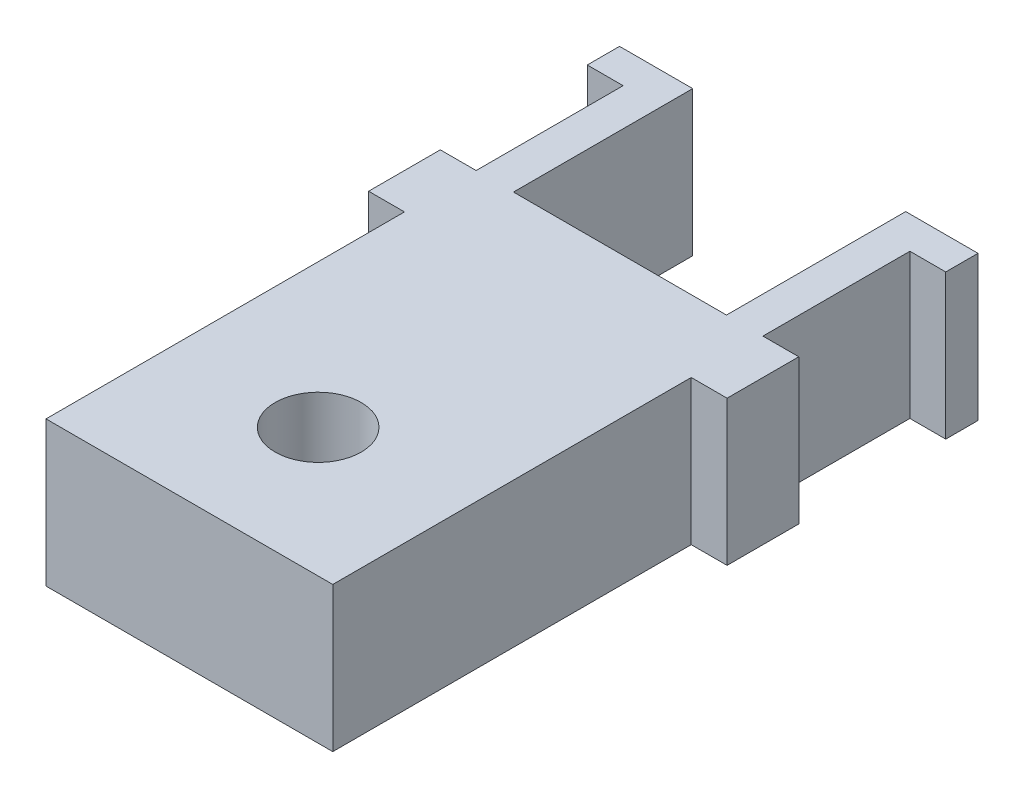
ISO-10303-21;
HEADER;
FILE_DESCRIPTION(('STEP AP214'),'2;1');
FILE_NAME('part.step','',(''),(''),'','','');
FILE_SCHEMA(('AUTOMOTIVE_DESIGN { 1 0 10303 214 1 1 1 1 }'));
ENDSEC;
DATA;
#1=APPLICATION_CONTEXT('core data for automotive mechanical design processes');
#2=APPLICATION_PROTOCOL_DEFINITION('international standard','automotive_design',2000,#1);
#3=PRODUCT_CONTEXT('',#1,'mechanical');
#4=PRODUCT('Part','Part','',(#3));
#5=PRODUCT_RELATED_PRODUCT_CATEGORY('part','',(#4));
#6=PRODUCT_DEFINITION_FORMATION('','',#4);
#7=PRODUCT_DEFINITION_CONTEXT('part definition',#1,'design');
#8=PRODUCT_DEFINITION('design','',#6,#7);
#9=PRODUCT_DEFINITION_SHAPE('','',#8);
#10=(LENGTH_UNIT() NAMED_UNIT(*) SI_UNIT(.MILLI.,.METRE.));
#11=(NAMED_UNIT(*) PLANE_ANGLE_UNIT() SI_UNIT($,.RADIAN.));
#12=(NAMED_UNIT(*) SI_UNIT($,.STERADIAN.) SOLID_ANGLE_UNIT());
#13=UNCERTAINTY_MEASURE_WITH_UNIT(LENGTH_MEASURE(1.E-05),#10,'distance_accuracy_value','');
#14=(GEOMETRIC_REPRESENTATION_CONTEXT(3) GLOBAL_UNCERTAINTY_ASSIGNED_CONTEXT((#13)) GLOBAL_UNIT_ASSIGNED_CONTEXT((#10,
#11,#12)) REPRESENTATION_CONTEXT('',''));
#15=CARTESIAN_POINT('',(0.,0.,0.));
#16=DIRECTION('',(0.,0.,1.));
#17=DIRECTION('',(1.,0.,0.));
#18=AXIS2_PLACEMENT_3D('',#15,#16,#17);
#19=CARTESIAN_POINT('',(0.,5.1308,0.));
#20=DIRECTION('',(0.,1.,0.));
#21=DIRECTION('',(0.,0.,1.));
#22=AXIS2_PLACEMENT_3D('',#19,#20,#21);
#23=PLANE('',#22);
#24=DIRECTION('',(0.,0.,-1.));
#25=VECTOR('',#24,1.);
#26=CARTESIAN_POINT('',(5.08,5.1308,-5.07999999999998));
#27=LINE('',#26,#25);
#28=CARTESIAN_POINT('',(5.08000000000001,5.1308,7.62000000000002));
#29=VERTEX_POINT('',#28);
#30=CARTESIAN_POINT('',(5.08,5.1308,-5.07999999999998));
#31=VERTEX_POINT('',#30);
#32=EDGE_CURVE('E241',#29,#31,#27,.T.);
#33=ORIENTED_EDGE('',*,*,#32,.T.);
#34=DIRECTION('',(1.,0.,0.));
#35=VECTOR('',#34,1.);
#36=CARTESIAN_POINT('',(6.35,5.1308,-5.07999999999998));
#37=LINE('',#36,#35);
#38=CARTESIAN_POINT('',(6.35,5.1308,-5.07999999999998));
#39=VERTEX_POINT('',#38);
#40=EDGE_CURVE('E129',#31,#39,#37,.T.);
#41=ORIENTED_EDGE('',*,*,#40,.T.);
#42=DIRECTION('',(0.,0.,-1.));
#43=VECTOR('',#42,1.);
#44=CARTESIAN_POINT('',(6.35,5.1308,-7.61999999999998));
#45=LINE('',#44,#43);
#46=CARTESIAN_POINT('',(6.35,5.1308,-7.61999999999998));
#47=VERTEX_POINT('',#46);
#48=EDGE_CURVE('E292',#39,#47,#45,.T.);
#49=ORIENTED_EDGE('',*,*,#48,.T.);
#50=DIRECTION('',(-1.,0.,0.));
#51=VECTOR('',#50,1.);
#52=CARTESIAN_POINT('',(6.35,5.1308,-7.61999999999998));
#53=LINE('',#52,#51);
#54=CARTESIAN_POINT('',(5.08,5.1308,-7.61999999999998));
#55=VERTEX_POINT('',#54);
#56=EDGE_CURVE('E311',#47,#55,#53,.T.);
#57=ORIENTED_EDGE('',*,*,#56,.T.);
#58=DIRECTION('',(0.,0.,-1.));
#59=VECTOR('',#58,1.);
#60=CARTESIAN_POINT('',(5.08,5.1308,-7.61999999999998));
#61=LINE('',#60,#59);
#62=CARTESIAN_POINT('',(5.08,5.1308,-12.827));
#63=VERTEX_POINT('',#62);
#64=EDGE_CURVE('E308',#55,#63,#61,.T.);
#65=ORIENTED_EDGE('',*,*,#64,.T.);
#66=DIRECTION('',(1.,0.,0.));
#67=VECTOR('',#66,1.);
#68=CARTESIAN_POINT('',(5.08,5.1308,-12.827));
#69=LINE('',#68,#67);
#70=CARTESIAN_POINT('',(6.35,5.1308,-12.827));
#71=VERTEX_POINT('',#70);
#72=EDGE_CURVE('E310',#63,#71,#69,.T.);
#73=ORIENTED_EDGE('',*,*,#72,.T.);
#74=DIRECTION('',(0.,0.,-1.));
#75=VECTOR('',#74,1.);
#76=CARTESIAN_POINT('',(6.35,5.1308,-12.827));
#77=LINE('',#76,#75);
#78=CARTESIAN_POINT('',(6.35,5.1308,-13.97));
#79=VERTEX_POINT('',#78);
#80=EDGE_CURVE('E313',#71,#79,#77,.T.);
#81=ORIENTED_EDGE('',*,*,#80,.T.);
#82=DIRECTION('',(-1.,0.,0.));
#83=VECTOR('',#82,1.);
#84=CARTESIAN_POINT('',(6.35,5.1308,-13.97));
#85=LINE('',#84,#83);
#86=CARTESIAN_POINT('',(3.78911020790426,5.1308,-13.97));
#87=VERTEX_POINT('',#86);
#88=EDGE_CURVE('E319',#79,#87,#85,.T.);
#89=ORIENTED_EDGE('',*,*,#88,.T.);
#90=DIRECTION('',(0.,0.,1.));
#91=VECTOR('',#90,1.);
#92=CARTESIAN_POINT('',(3.78911020790426,5.1308,-7.61999999999998));
#93=LINE('',#92,#91);
#94=CARTESIAN_POINT('',(3.78911020790426,5.1308,-7.61999999999998));
#95=VERTEX_POINT('',#94);
#96=EDGE_CURVE('E321',#87,#95,#93,.T.);
#97=ORIENTED_EDGE('',*,*,#96,.T.);
#98=DIRECTION('',(-1.,0.,0.));
#99=VECTOR('',#98,1.);
#100=CARTESIAN_POINT('',(-3.75783160857777,5.1308,-7.61999999999998));
#101=LINE('',#100,#99);
#102=CARTESIAN_POINT('',(-3.75783160857777,5.1308,-7.61999999999998));
#103=VERTEX_POINT('',#102);
#104=EDGE_CURVE('E323',#95,#103,#101,.T.);
#105=ORIENTED_EDGE('',*,*,#104,.T.);
#106=DIRECTION('',(0.,0.,-1.));
#107=VECTOR('',#106,1.);
#108=CARTESIAN_POINT('',(-3.75783160857777,5.1308,-7.61999999999998));
#109=LINE('',#108,#107);
#110=CARTESIAN_POINT('',(-3.75783160857777,5.1308,-13.97));
#111=VERTEX_POINT('',#110);
#112=EDGE_CURVE('E325',#103,#111,#109,.T.);
#113=ORIENTED_EDGE('',*,*,#112,.T.);
#114=DIRECTION('',(-1.,0.,0.));
#115=VECTOR('',#114,1.);
#116=CARTESIAN_POINT('',(-3.75783160857777,5.1308,-13.97));
#117=LINE('',#116,#115);
#118=CARTESIAN_POINT('',(-6.35,5.1308,-13.97));
#119=VERTEX_POINT('',#118);
#120=EDGE_CURVE('E327',#111,#119,#117,.T.);
#121=ORIENTED_EDGE('',*,*,#120,.T.);
#122=DIRECTION('',(0.,0.,1.));
#123=VECTOR('',#122,1.);
#124=CARTESIAN_POINT('',(-6.35,5.1308,-12.827));
#125=LINE('',#124,#123);
#126=CARTESIAN_POINT('',(-6.35,5.1308,-12.827));
#127=VERTEX_POINT('',#126);
#128=EDGE_CURVE('E329',#119,#127,#125,.T.);
#129=ORIENTED_EDGE('',*,*,#128,.T.);
#130=DIRECTION('',(1.,0.,0.));
#131=VECTOR('',#130,1.);
#132=CARTESIAN_POINT('',(-5.08,5.1308,-12.827));
#133=LINE('',#132,#131);
#134=CARTESIAN_POINT('',(-5.08,5.1308,-12.827));
#135=VERTEX_POINT('',#134);
#136=EDGE_CURVE('E331',#127,#135,#133,.T.);
#137=ORIENTED_EDGE('',*,*,#136,.T.);
#138=DIRECTION('',(0.,0.,1.));
#139=VECTOR('',#138,1.);
#140=CARTESIAN_POINT('',(-5.08,5.1308,-7.61999999999998));
#141=LINE('',#140,#139);
#142=CARTESIAN_POINT('',(-5.08,5.1308,-7.61999999999998));
#143=VERTEX_POINT('',#142);
#144=EDGE_CURVE('E333',#135,#143,#141,.T.);
#145=ORIENTED_EDGE('',*,*,#144,.T.);
#146=DIRECTION('',(-1.,0.,0.));
#147=VECTOR('',#146,1.);
#148=CARTESIAN_POINT('',(-6.35,5.1308,-7.61999999999998));
#149=LINE('',#148,#147);
#150=CARTESIAN_POINT('',(-6.35,5.1308,-7.61999999999998));
#151=VERTEX_POINT('',#150);
#152=EDGE_CURVE('E335',#143,#151,#149,.T.);
#153=ORIENTED_EDGE('',*,*,#152,.T.);
#154=DIRECTION('',(0.,0.,1.));
#155=VECTOR('',#154,1.);
#156=CARTESIAN_POINT('',(-6.35,5.1308,-7.61999999999998));
#157=LINE('',#156,#155);
#158=CARTESIAN_POINT('',(-6.35,5.1308,-5.07999999999998));
#159=VERTEX_POINT('',#158);
#160=EDGE_CURVE('E184',#151,#159,#157,.T.);
#161=ORIENTED_EDGE('',*,*,#160,.T.);
#162=DIRECTION('',(1.,0.,0.));
#163=VECTOR('',#162,1.);
#164=CARTESIAN_POINT('',(-6.35,5.1308,-5.07999999999998));
#165=LINE('',#164,#163);
#166=CARTESIAN_POINT('',(-5.08,5.1308,-5.07999999999998));
#167=VERTEX_POINT('',#166);
#168=EDGE_CURVE('E178',#159,#167,#165,.T.);
#169=ORIENTED_EDGE('',*,*,#168,.T.);
#170=DIRECTION('',(0.,0.,1.));
#171=VECTOR('',#170,1.);
#172=CARTESIAN_POINT('',(-5.08,5.1308,-5.07999999999998));
#173=LINE('',#172,#171);
#174=CARTESIAN_POINT('',(-5.08000000000004,5.1308,7.62000000000002));
#175=VERTEX_POINT('',#174);
#176=EDGE_CURVE('E182',#167,#175,#173,.T.);
#177=ORIENTED_EDGE('',*,*,#176,.T.);
#178=DIRECTION('',(1.,0.,0.));
#179=VECTOR('',#178,1.);
#180=CARTESIAN_POINT('',(-5.08000000000004,5.1308,7.62000000000002));
#181=LINE('',#180,#179);
#182=EDGE_CURVE('E50',#175,#29,#181,.T.);
#183=ORIENTED_EDGE('',*,*,#182,.T.);
#184=EDGE_LOOP('',(#33,#41,#49,#57,#65,#73,#81,#89,#97,#105,#113,#121,#129,#137,#145,#153,#161,
#169,#177,#183));
#185=FACE_BOUND('',#184,.T.);
#186=CARTESIAN_POINT('',(0.,5.1308,3.05755815516299));
#187=DIRECTION('',(0.,1.,0.));
#188=DIRECTION('',(0.,0.,1.));
#189=AXIS2_PLACEMENT_3D('',#186,#187,#188);
#190=CIRCLE('',#189,1.524);
#191=CARTESIAN_POINT('',(0.,5.1308,4.58155815516299));
#192=VERTEX_POINT('',#191);
#193=EDGE_CURVE('E206',#192,#192,#190,.T.);
#194=ORIENTED_EDGE('',*,*,#193,.F.);
#195=EDGE_LOOP('',(#194));
#196=FACE_BOUND('',#195,.T.);
#197=ADVANCED_FACE('F33',(#185,#196),#23,.T.);
#198=CARTESIAN_POINT('',(0.,0.,0.));
#199=DIRECTION('',(0.,1.,0.));
#200=DIRECTION('',(0.,0.,1.));
#201=AXIS2_PLACEMENT_3D('',#198,#199,#200);
#202=PLANE('',#201);
#203=DIRECTION('',(0.,0.,-1.));
#204=VECTOR('',#203,1.);
#205=CARTESIAN_POINT('',(5.08,0.,-5.07999999999998));
#206=LINE('',#205,#204);
#207=CARTESIAN_POINT('',(5.08000000000001,0.,7.62000000000002));
#208=VERTEX_POINT('',#207);
#209=CARTESIAN_POINT('',(5.08,0.,-5.07999999999998));
#210=VERTEX_POINT('',#209);
#211=EDGE_CURVE('E202',#208,#210,#206,.T.);
#212=ORIENTED_EDGE('',*,*,#211,.F.);
#213=DIRECTION('',(1.,0.,0.));
#214=VECTOR('',#213,1.);
#215=CARTESIAN_POINT('',(-5.08000000000004,0.,7.62000000000002));
#216=LINE('',#215,#214);
#217=CARTESIAN_POINT('',(-5.08000000000004,0.,7.62000000000002));
#218=VERTEX_POINT('',#217);
#219=EDGE_CURVE('E121',#218,#208,#216,.T.);
#220=ORIENTED_EDGE('',*,*,#219,.F.);
#221=DIRECTION('',(0.,0.,1.));
#222=VECTOR('',#221,1.);
#223=CARTESIAN_POINT('',(-5.08,0.,-5.07999999999998));
#224=LINE('',#223,#222);
#225=CARTESIAN_POINT('',(-5.08,0.,-5.07999999999998));
#226=VERTEX_POINT('',#225);
#227=EDGE_CURVE('E115',#226,#218,#224,.T.);
#228=ORIENTED_EDGE('',*,*,#227,.F.);
#229=DIRECTION('',(1.,0.,0.));
#230=VECTOR('',#229,1.);
#231=CARTESIAN_POINT('',(-6.35,0.,-5.07999999999998));
#232=LINE('',#231,#230);
#233=CARTESIAN_POINT('',(-6.35,0.,-5.07999999999998));
#234=VERTEX_POINT('',#233);
#235=EDGE_CURVE('E192',#234,#226,#232,.T.);
#236=ORIENTED_EDGE('',*,*,#235,.F.);
#237=DIRECTION('',(0.,0.,1.));
#238=VECTOR('',#237,1.);
#239=CARTESIAN_POINT('',(-6.35,0.,-7.61999999999998));
#240=LINE('',#239,#238);
#241=CARTESIAN_POINT('',(-6.35,0.,-7.61999999999998));
#242=VERTEX_POINT('',#241);
#243=EDGE_CURVE('E236',#242,#234,#240,.T.);
#244=ORIENTED_EDGE('',*,*,#243,.F.);
#245=DIRECTION('',(-1.,0.,0.));
#246=VECTOR('',#245,1.);
#247=CARTESIAN_POINT('',(-6.35,0.,-7.61999999999998));
#248=LINE('',#247,#246);
#249=CARTESIAN_POINT('',(-5.08,0.,-7.61999999999998));
#250=VERTEX_POINT('',#249);
#251=EDGE_CURVE('E234',#250,#242,#248,.T.);
#252=ORIENTED_EDGE('',*,*,#251,.F.);
#253=DIRECTION('',(0.,0.,1.));
#254=VECTOR('',#253,1.);
#255=CARTESIAN_POINT('',(-5.08,0.,-7.61999999999998));
#256=LINE('',#255,#254);
#257=CARTESIAN_POINT('',(-5.08,0.,-12.827));
#258=VERTEX_POINT('',#257);
#259=EDGE_CURVE('E232',#258,#250,#256,.T.);
#260=ORIENTED_EDGE('',*,*,#259,.F.);
#261=DIRECTION('',(1.,0.,0.));
#262=VECTOR('',#261,1.);
#263=CARTESIAN_POINT('',(-5.08,0.,-12.827));
#264=LINE('',#263,#262);
#265=CARTESIAN_POINT('',(-6.35,0.,-12.827));
#266=VERTEX_POINT('',#265);
#267=EDGE_CURVE('E230',#266,#258,#264,.T.);
#268=ORIENTED_EDGE('',*,*,#267,.F.);
#269=DIRECTION('',(0.,0.,1.));
#270=VECTOR('',#269,1.);
#271=CARTESIAN_POINT('',(-6.35,0.,-12.827));
#272=LINE('',#271,#270);
#273=CARTESIAN_POINT('',(-6.35,0.,-13.97));
#274=VERTEX_POINT('',#273);
#275=EDGE_CURVE('E228',#274,#266,#272,.T.);
#276=ORIENTED_EDGE('',*,*,#275,.F.);
#277=DIRECTION('',(-1.,0.,0.));
#278=VECTOR('',#277,1.);
#279=CARTESIAN_POINT('',(-3.75783160857777,0.,-13.97));
#280=LINE('',#279,#278);
#281=CARTESIAN_POINT('',(-3.75783160857777,0.,-13.97));
#282=VERTEX_POINT('',#281);
#283=EDGE_CURVE('E226',#282,#274,#280,.T.);
#284=ORIENTED_EDGE('',*,*,#283,.F.);
#285=DIRECTION('',(0.,0.,-1.));
#286=VECTOR('',#285,1.);
#287=CARTESIAN_POINT('',(-3.75783160857777,0.,-7.61999999999998));
#288=LINE('',#287,#286);
#289=CARTESIAN_POINT('',(-3.75783160857777,0.,-7.61999999999998));
#290=VERTEX_POINT('',#289);
#291=EDGE_CURVE('E224',#290,#282,#288,.T.);
#292=ORIENTED_EDGE('',*,*,#291,.F.);
#293=DIRECTION('',(-1.,0.,0.));
#294=VECTOR('',#293,1.);
#295=CARTESIAN_POINT('',(-3.75783160857777,0.,-7.61999999999998));
#296=LINE('',#295,#294);
#297=CARTESIAN_POINT('',(3.78911020790426,0.,-7.61999999999998));
#298=VERTEX_POINT('',#297);
#299=EDGE_CURVE('E222',#298,#290,#296,.T.);
#300=ORIENTED_EDGE('',*,*,#299,.F.);
#301=DIRECTION('',(0.,0.,1.));
#302=VECTOR('',#301,1.);
#303=CARTESIAN_POINT('',(3.78911020790426,0.,-7.61999999999998));
#304=LINE('',#303,#302);
#305=CARTESIAN_POINT('',(3.78911020790426,0.,-13.97));
#306=VERTEX_POINT('',#305);
#307=EDGE_CURVE('E220',#306,#298,#304,.T.);
#308=ORIENTED_EDGE('',*,*,#307,.F.);
#309=DIRECTION('',(-1.,0.,0.));
#310=VECTOR('',#309,1.);
#311=CARTESIAN_POINT('',(6.35,0.,-13.97));
#312=LINE('',#311,#310);
#313=CARTESIAN_POINT('',(6.35,0.,-13.97));
#314=VERTEX_POINT('',#313);
#315=EDGE_CURVE('E218',#314,#306,#312,.T.);
#316=ORIENTED_EDGE('',*,*,#315,.F.);
#317=DIRECTION('',(0.,0.,-1.));
#318=VECTOR('',#317,1.);
#319=CARTESIAN_POINT('',(6.35,0.,-12.827));
#320=LINE('',#319,#318);
#321=CARTESIAN_POINT('',(6.35,0.,-12.827));
#322=VERTEX_POINT('',#321);
#323=EDGE_CURVE('E216',#322,#314,#320,.T.);
#324=ORIENTED_EDGE('',*,*,#323,.F.);
#325=DIRECTION('',(1.,0.,0.));
#326=VECTOR('',#325,1.);
#327=CARTESIAN_POINT('',(5.08,0.,-12.827));
#328=LINE('',#327,#326);
#329=CARTESIAN_POINT('',(5.08,0.,-12.827));
#330=VERTEX_POINT('',#329);
#331=EDGE_CURVE('E214',#330,#322,#328,.T.);
#332=ORIENTED_EDGE('',*,*,#331,.F.);
#333=DIRECTION('',(0.,0.,-1.));
#334=VECTOR('',#333,1.);
#335=CARTESIAN_POINT('',(5.08,0.,-7.61999999999998));
#336=LINE('',#335,#334);
#337=CARTESIAN_POINT('',(5.08,0.,-7.61999999999998));
#338=VERTEX_POINT('',#337);
#339=EDGE_CURVE('E212',#338,#330,#336,.T.);
#340=ORIENTED_EDGE('',*,*,#339,.F.);
#341=DIRECTION('',(-1.,0.,0.));
#342=VECTOR('',#341,1.);
#343=CARTESIAN_POINT('',(6.35,0.,-7.61999999999998));
#344=LINE('',#343,#342);
#345=CARTESIAN_POINT('',(6.35,0.,-7.61999999999998));
#346=VERTEX_POINT('',#345);
#347=EDGE_CURVE('E210',#346,#338,#344,.T.);
#348=ORIENTED_EDGE('',*,*,#347,.F.);
#349=DIRECTION('',(0.,0.,-1.));
#350=VECTOR('',#349,1.);
#351=CARTESIAN_POINT('',(6.35,0.,-7.61999999999998));
#352=LINE('',#351,#350);
#353=CARTESIAN_POINT('',(6.35,0.,-5.07999999999998));
#354=VERTEX_POINT('',#353);
#355=EDGE_CURVE('E208',#354,#346,#352,.T.);
#356=ORIENTED_EDGE('',*,*,#355,.F.);
#357=DIRECTION('',(1.,0.,0.));
#358=VECTOR('',#357,1.);
#359=CARTESIAN_POINT('',(6.35,0.,-5.07999999999998));
#360=LINE('',#359,#358);
#361=EDGE_CURVE('E205',#210,#354,#360,.T.);
#362=ORIENTED_EDGE('',*,*,#361,.F.);
#363=EDGE_LOOP('',(#212,#220,#228,#236,#244,#252,#260,#268,#276,#284,#292,#300,#308,#316,#324,
#332,#340,#348,#356,#362));
#364=FACE_BOUND('',#363,.T.);
#365=CARTESIAN_POINT('',(0.,0.,3.05755815516299));
#366=DIRECTION('',(0.,1.,0.));
#367=DIRECTION('',(0.,0.,1.));
#368=AXIS2_PLACEMENT_3D('',#365,#366,#367);
#369=CIRCLE('',#368,1.524);
#370=CARTESIAN_POINT('',(0.,0.,4.58155815516299));
#371=VERTEX_POINT('',#370);
#372=EDGE_CURVE('E586',#371,#371,#369,.T.);
#373=ORIENTED_EDGE('',*,*,#372,.T.);
#374=EDGE_LOOP('',(#373));
#375=FACE_BOUND('',#374,.T.);
#376=ADVANCED_FACE('F296',(#364,#375),#202,.F.);
#377=CARTESIAN_POINT('',(5.08,5.1308,-5.07999999999998));
#378=DIRECTION('',(-1.,0.,0.));
#379=DIRECTION('',(0.,0.,1.));
#380=AXIS2_PLACEMENT_3D('',#377,#378,#379);
#381=PLANE('',#380);
#382=ORIENTED_EDGE('',*,*,#211,.T.);
#383=DIRECTION('',(0.,-1.,0.));
#384=VECTOR('',#383,1.);
#385=CARTESIAN_POINT('',(5.08,5.1308,-5.07999999999998));
#386=LINE('',#385,#384);
#387=EDGE_CURVE('E11',#31,#210,#386,.T.);
#388=ORIENTED_EDGE('',*,*,#387,.F.);
#389=ORIENTED_EDGE('',*,*,#32,.F.);
#390=DIRECTION('',(0.,-1.,0.));
#391=VECTOR('',#390,1.);
#392=CARTESIAN_POINT('',(5.08000000000001,5.1308,7.62000000000002));
#393=LINE('',#392,#391);
#394=EDGE_CURVE('E198',#29,#208,#393,.T.);
#395=ORIENTED_EDGE('',*,*,#394,.T.);
#396=EDGE_LOOP('',(#382,#388,#389,#395));
#397=FACE_BOUND('',#396,.T.);
#398=ADVANCED_FACE('F35',(#397),#381,.F.);
#399=CARTESIAN_POINT('',(6.35,5.1308,-5.07999999999998));
#400=DIRECTION('',(0.,0.,-1.));
#401=DIRECTION('',(-1.,0.,0.));
#402=AXIS2_PLACEMENT_3D('',#399,#400,#401);
#403=PLANE('',#402);
#404=ORIENTED_EDGE('',*,*,#361,.T.);
#405=DIRECTION('',(0.,-1.,0.));
#406=VECTOR('',#405,1.);
#407=CARTESIAN_POINT('',(6.35,5.1308,-5.07999999999998));
#408=LINE('',#407,#406);
#409=EDGE_CURVE('E42',#39,#354,#408,.T.);
#410=ORIENTED_EDGE('',*,*,#409,.F.);
#411=ORIENTED_EDGE('',*,*,#40,.F.);
#412=ORIENTED_EDGE('',*,*,#387,.T.);
#413=EDGE_LOOP('',(#404,#410,#411,#412));
#414=FACE_BOUND('',#413,.T.);
#415=ADVANCED_FACE('F369',(#414),#403,.F.);
#416=CARTESIAN_POINT('',(6.35,5.1308,-7.61999999999998));
#417=DIRECTION('',(-1.,0.,0.));
#418=DIRECTION('',(0.,0.,1.));
#419=AXIS2_PLACEMENT_3D('',#416,#417,#418);
#420=PLANE('',#419);
#421=ORIENTED_EDGE('',*,*,#355,.T.);
#422=DIRECTION('',(0.,-1.,0.));
#423=VECTOR('',#422,1.);
#424=CARTESIAN_POINT('',(6.35,5.1308,-7.61999999999998));
#425=LINE('',#424,#423);
#426=EDGE_CURVE('E284',#47,#346,#425,.T.);
#427=ORIENTED_EDGE('',*,*,#426,.F.);
#428=ORIENTED_EDGE('',*,*,#48,.F.);
#429=ORIENTED_EDGE('',*,*,#409,.T.);
#430=EDGE_LOOP('',(#421,#427,#428,#429));
#431=FACE_BOUND('',#430,.T.);
#432=ADVANCED_FACE('F290',(#431),#420,.F.);
#433=CARTESIAN_POINT('',(6.35,5.1308,-7.61999999999998));
#434=DIRECTION('',(0.,0.,1.));
#435=DIRECTION('',(1.,0.,0.));
#436=AXIS2_PLACEMENT_3D('',#433,#434,#435);
#437=PLANE('',#436);
#438=ORIENTED_EDGE('',*,*,#347,.T.);
#439=DIRECTION('',(0.,-1.,0.));
#440=VECTOR('',#439,1.);
#441=CARTESIAN_POINT('',(5.08,5.1308,-7.61999999999998));
#442=LINE('',#441,#440);
#443=EDGE_CURVE('E281',#55,#338,#442,.T.);
#444=ORIENTED_EDGE('',*,*,#443,.F.);
#445=ORIENTED_EDGE('',*,*,#56,.F.);
#446=ORIENTED_EDGE('',*,*,#426,.T.);
#447=EDGE_LOOP('',(#438,#444,#445,#446));
#448=FACE_BOUND('',#447,.T.);
#449=ADVANCED_FACE('F302',(#448),#437,.F.);
#450=CARTESIAN_POINT('',(5.08,5.1308,-7.61999999999998));
#451=DIRECTION('',(-1.,0.,0.));
#452=DIRECTION('',(0.,0.,1.));
#453=AXIS2_PLACEMENT_3D('',#450,#451,#452);
#454=PLANE('',#453);
#455=ORIENTED_EDGE('',*,*,#339,.T.);
#456=DIRECTION('',(0.,-1.,0.));
#457=VECTOR('',#456,1.);
#458=CARTESIAN_POINT('',(5.08,5.1308,-12.827));
#459=LINE('',#458,#457);
#460=EDGE_CURVE('E278',#63,#330,#459,.T.);
#461=ORIENTED_EDGE('',*,*,#460,.F.);
#462=ORIENTED_EDGE('',*,*,#64,.F.);
#463=ORIENTED_EDGE('',*,*,#443,.T.);
#464=EDGE_LOOP('',(#455,#461,#462,#463));
#465=FACE_BOUND('',#464,.T.);
#466=ADVANCED_FACE('F306',(#465),#454,.F.);
#467=CARTESIAN_POINT('',(5.08,5.1308,-12.827));
#468=DIRECTION('',(0.,0.,-1.));
#469=DIRECTION('',(-1.,0.,0.));
#470=AXIS2_PLACEMENT_3D('',#467,#468,#469);
#471=PLANE('',#470);
#472=ORIENTED_EDGE('',*,*,#331,.T.);
#473=DIRECTION('',(0.,-1.,0.));
#474=VECTOR('',#473,1.);
#475=CARTESIAN_POINT('',(6.35,5.1308,-12.827));
#476=LINE('',#475,#474);
#477=EDGE_CURVE('E275',#71,#322,#476,.T.);
#478=ORIENTED_EDGE('',*,*,#477,.F.);
#479=ORIENTED_EDGE('',*,*,#72,.F.);
#480=ORIENTED_EDGE('',*,*,#460,.T.);
#481=EDGE_LOOP('',(#472,#478,#479,#480));
#482=FACE_BOUND('',#481,.T.);
#483=ADVANCED_FACE('F382',(#482),#471,.F.);
#484=CARTESIAN_POINT('',(6.35,5.1308,-12.827));
#485=DIRECTION('',(-1.,0.,0.));
#486=DIRECTION('',(0.,0.,1.));
#487=AXIS2_PLACEMENT_3D('',#484,#485,#486);
#488=PLANE('',#487);
#489=ORIENTED_EDGE('',*,*,#323,.T.);
#490=DIRECTION('',(0.,-1.,0.));
#491=VECTOR('',#490,1.);
#492=CARTESIAN_POINT('',(6.35,5.1308,-13.97));
#493=LINE('',#492,#491);
#494=EDGE_CURVE('E272',#79,#314,#493,.T.);
#495=ORIENTED_EDGE('',*,*,#494,.F.);
#496=ORIENTED_EDGE('',*,*,#80,.F.);
#497=ORIENTED_EDGE('',*,*,#477,.T.);
#498=EDGE_LOOP('',(#489,#495,#496,#497));
#499=FACE_BOUND('',#498,.T.);
#500=ADVANCED_FACE('F385',(#499),#488,.F.);
#501=CARTESIAN_POINT('',(6.35,5.1308,-13.97));
#502=DIRECTION('',(0.,0.,1.));
#503=DIRECTION('',(1.,0.,0.));
#504=AXIS2_PLACEMENT_3D('',#501,#502,#503);
#505=PLANE('',#504);
#506=ORIENTED_EDGE('',*,*,#315,.T.);
#507=DIRECTION('',(0.,-1.,0.));
#508=VECTOR('',#507,1.);
#509=CARTESIAN_POINT('',(3.78911020790426,5.1308,-13.97));
#510=LINE('',#509,#508);
#511=EDGE_CURVE('E269',#87,#306,#510,.T.);
#512=ORIENTED_EDGE('',*,*,#511,.F.);
#513=ORIENTED_EDGE('',*,*,#88,.F.);
#514=ORIENTED_EDGE('',*,*,#494,.T.);
#515=EDGE_LOOP('',(#506,#512,#513,#514));
#516=FACE_BOUND('',#515,.T.);
#517=ADVANCED_FACE('F389',(#516),#505,.F.);
#518=CARTESIAN_POINT('',(3.78911020790426,5.1308,-7.61999999999998));
#519=DIRECTION('',(1.,0.,0.));
#520=DIRECTION('',(0.,0.,-1.));
#521=AXIS2_PLACEMENT_3D('',#518,#519,#520);
#522=PLANE('',#521);
#523=ORIENTED_EDGE('',*,*,#307,.T.);
#524=DIRECTION('',(0.,-1.,0.));
#525=VECTOR('',#524,1.);
#526=CARTESIAN_POINT('',(3.78911020790426,5.1308,-7.61999999999998));
#527=LINE('',#526,#525);
#528=EDGE_CURVE('E266',#95,#298,#527,.T.);
#529=ORIENTED_EDGE('',*,*,#528,.F.);
#530=ORIENTED_EDGE('',*,*,#96,.F.);
#531=ORIENTED_EDGE('',*,*,#511,.T.);
#532=EDGE_LOOP('',(#523,#529,#530,#531));
#533=FACE_BOUND('',#532,.T.);
#534=ADVANCED_FACE('F393',(#533),#522,.F.);
#535=CARTESIAN_POINT('',(-3.75783160857777,5.1308,-7.61999999999998));
#536=DIRECTION('',(0.,0.,1.));
#537=DIRECTION('',(1.,0.,0.));
#538=AXIS2_PLACEMENT_3D('',#535,#536,#537);
#539=PLANE('',#538);
#540=ORIENTED_EDGE('',*,*,#299,.T.);
#541=DIRECTION('',(0.,-1.,0.));
#542=VECTOR('',#541,1.);
#543=CARTESIAN_POINT('',(-3.75783160857777,5.1308,-7.61999999999998));
#544=LINE('',#543,#542);
#545=EDGE_CURVE('E263',#103,#290,#544,.T.);
#546=ORIENTED_EDGE('',*,*,#545,.F.);
#547=ORIENTED_EDGE('',*,*,#104,.F.);
#548=ORIENTED_EDGE('',*,*,#528,.T.);
#549=EDGE_LOOP('',(#540,#546,#547,#548));
#550=FACE_BOUND('',#549,.T.);
#551=ADVANCED_FACE('F397',(#550),#539,.F.);
#552=CARTESIAN_POINT('',(-3.75783160857777,5.1308,-7.61999999999998));
#553=DIRECTION('',(-1.,0.,0.));
#554=DIRECTION('',(0.,0.,1.));
#555=AXIS2_PLACEMENT_3D('',#552,#553,#554);
#556=PLANE('',#555);
#557=ORIENTED_EDGE('',*,*,#291,.T.);
#558=DIRECTION('',(0.,-1.,0.));
#559=VECTOR('',#558,1.);
#560=CARTESIAN_POINT('',(-3.75783160857777,5.1308,-13.97));
#561=LINE('',#560,#559);
#562=EDGE_CURVE('E260',#111,#282,#561,.T.);
#563=ORIENTED_EDGE('',*,*,#562,.F.);
#564=ORIENTED_EDGE('',*,*,#112,.F.);
#565=ORIENTED_EDGE('',*,*,#545,.T.);
#566=EDGE_LOOP('',(#557,#563,#564,#565));
#567=FACE_BOUND('',#566,.T.);
#568=ADVANCED_FACE('F401',(#567),#556,.F.);
#569=CARTESIAN_POINT('',(-3.75783160857777,5.1308,-13.97));
#570=DIRECTION('',(0.,0.,1.));
#571=DIRECTION('',(1.,0.,0.));
#572=AXIS2_PLACEMENT_3D('',#569,#570,#571);
#573=PLANE('',#572);
#574=ORIENTED_EDGE('',*,*,#283,.T.);
#575=DIRECTION('',(0.,-1.,0.));
#576=VECTOR('',#575,1.);
#577=CARTESIAN_POINT('',(-6.35,5.1308,-13.97));
#578=LINE('',#577,#576);
#579=EDGE_CURVE('E257',#119,#274,#578,.T.);
#580=ORIENTED_EDGE('',*,*,#579,.F.);
#581=ORIENTED_EDGE('',*,*,#120,.F.);
#582=ORIENTED_EDGE('',*,*,#562,.T.);
#583=EDGE_LOOP('',(#574,#580,#581,#582));
#584=FACE_BOUND('',#583,.T.);
#585=ADVANCED_FACE('F405',(#584),#573,.F.);
#586=CARTESIAN_POINT('',(-6.35,5.1308,-12.827));
#587=DIRECTION('',(1.,0.,0.));
#588=DIRECTION('',(0.,0.,-1.));
#589=AXIS2_PLACEMENT_3D('',#586,#587,#588);
#590=PLANE('',#589);
#591=ORIENTED_EDGE('',*,*,#275,.T.);
#592=DIRECTION('',(0.,-1.,0.));
#593=VECTOR('',#592,1.);
#594=CARTESIAN_POINT('',(-6.35,5.1308,-12.827));
#595=LINE('',#594,#593);
#596=EDGE_CURVE('E254',#127,#266,#595,.T.);
#597=ORIENTED_EDGE('',*,*,#596,.F.);
#598=ORIENTED_EDGE('',*,*,#128,.F.);
#599=ORIENTED_EDGE('',*,*,#579,.T.);
#600=EDGE_LOOP('',(#591,#597,#598,#599));
#601=FACE_BOUND('',#600,.T.);
#602=ADVANCED_FACE('F409',(#601),#590,.F.);
#603=CARTESIAN_POINT('',(-5.08,5.1308,-12.827));
#604=DIRECTION('',(0.,0.,-1.));
#605=DIRECTION('',(-1.,0.,0.));
#606=AXIS2_PLACEMENT_3D('',#603,#604,#605);
#607=PLANE('',#606);
#608=ORIENTED_EDGE('',*,*,#267,.T.);
#609=DIRECTION('',(0.,-1.,0.));
#610=VECTOR('',#609,1.);
#611=CARTESIAN_POINT('',(-5.08,5.1308,-12.827));
#612=LINE('',#611,#610);
#613=EDGE_CURVE('E251',#135,#258,#612,.T.);
#614=ORIENTED_EDGE('',*,*,#613,.F.);
#615=ORIENTED_EDGE('',*,*,#136,.F.);
#616=ORIENTED_EDGE('',*,*,#596,.T.);
#617=EDGE_LOOP('',(#608,#614,#615,#616));
#618=FACE_BOUND('',#617,.T.);
#619=ADVANCED_FACE('F413',(#618),#607,.F.);
#620=CARTESIAN_POINT('',(-5.08,5.1308,-7.61999999999998));
#621=DIRECTION('',(1.,0.,0.));
#622=DIRECTION('',(0.,0.,-1.));
#623=AXIS2_PLACEMENT_3D('',#620,#621,#622);
#624=PLANE('',#623);
#625=ORIENTED_EDGE('',*,*,#259,.T.);
#626=DIRECTION('',(0.,-1.,0.));
#627=VECTOR('',#626,1.);
#628=CARTESIAN_POINT('',(-5.08,5.1308,-7.61999999999998));
#629=LINE('',#628,#627);
#630=EDGE_CURVE('E248',#143,#250,#629,.T.);
#631=ORIENTED_EDGE('',*,*,#630,.F.);
#632=ORIENTED_EDGE('',*,*,#144,.F.);
#633=ORIENTED_EDGE('',*,*,#613,.T.);
#634=EDGE_LOOP('',(#625,#631,#632,#633));
#635=FACE_BOUND('',#634,.T.);
#636=ADVANCED_FACE('F417',(#635),#624,.F.);
#637=CARTESIAN_POINT('',(-6.35,5.1308,-7.61999999999998));
#638=DIRECTION('',(0.,0.,1.));
#639=DIRECTION('',(1.,0.,0.));
#640=AXIS2_PLACEMENT_3D('',#637,#638,#639);
#641=PLANE('',#640);
#642=ORIENTED_EDGE('',*,*,#251,.T.);
#643=DIRECTION('',(0.,-1.,0.));
#644=VECTOR('',#643,1.);
#645=CARTESIAN_POINT('',(-6.35,5.1308,-7.61999999999998));
#646=LINE('',#645,#644);
#647=EDGE_CURVE('E245',#151,#242,#646,.T.);
#648=ORIENTED_EDGE('',*,*,#647,.F.);
#649=ORIENTED_EDGE('',*,*,#152,.F.);
#650=ORIENTED_EDGE('',*,*,#630,.T.);
#651=EDGE_LOOP('',(#642,#648,#649,#650));
#652=FACE_BOUND('',#651,.T.);
#653=ADVANCED_FACE('F341',(#652),#641,.F.);
#654=CARTESIAN_POINT('',(-6.35,5.1308,-7.61999999999998));
#655=DIRECTION('',(1.,0.,0.));
#656=DIRECTION('',(0.,0.,-1.));
#657=AXIS2_PLACEMENT_3D('',#654,#655,#656);
#658=PLANE('',#657);
#659=ORIENTED_EDGE('',*,*,#243,.T.);
#660=DIRECTION('',(0.,-1.,0.));
#661=VECTOR('',#660,1.);
#662=CARTESIAN_POINT('',(-6.35,5.1308,-5.07999999999998));
#663=LINE('',#662,#661);
#664=EDGE_CURVE('E193',#159,#234,#663,.T.);
#665=ORIENTED_EDGE('',*,*,#664,.F.);
#666=ORIENTED_EDGE('',*,*,#160,.F.);
#667=ORIENTED_EDGE('',*,*,#647,.T.);
#668=EDGE_LOOP('',(#659,#665,#666,#667));
#669=FACE_BOUND('',#668,.T.);
#670=ADVANCED_FACE('F345',(#669),#658,.F.);
#671=CARTESIAN_POINT('',(-6.35,5.1308,-5.07999999999998));
#672=DIRECTION('',(0.,0.,-1.));
#673=DIRECTION('',(-1.,0.,0.));
#674=AXIS2_PLACEMENT_3D('',#671,#672,#673);
#675=PLANE('',#674);
#676=ORIENTED_EDGE('',*,*,#235,.T.);
#677=DIRECTION('',(0.,-1.,0.));
#678=VECTOR('',#677,1.);
#679=CARTESIAN_POINT('',(-5.08,5.1308,-5.07999999999998));
#680=LINE('',#679,#678);
#681=EDGE_CURVE('E189',#167,#226,#680,.T.);
#682=ORIENTED_EDGE('',*,*,#681,.F.);
#683=ORIENTED_EDGE('',*,*,#168,.F.);
#684=ORIENTED_EDGE('',*,*,#664,.T.);
#685=EDGE_LOOP('',(#676,#682,#683,#684));
#686=FACE_BOUND('',#685,.T.);
#687=ADVANCED_FACE('F190',(#686),#675,.F.);
#688=CARTESIAN_POINT('',(-5.08,5.1308,-5.07999999999998));
#689=DIRECTION('',(1.,0.,0.));
#690=DIRECTION('',(0.,0.,-1.));
#691=AXIS2_PLACEMENT_3D('',#688,#689,#690);
#692=PLANE('',#691);
#693=ORIENTED_EDGE('',*,*,#227,.T.);
#694=DIRECTION('',(0.,-1.,0.));
#695=VECTOR('',#694,1.);
#696=CARTESIAN_POINT('',(-5.08000000000004,5.1308,7.62000000000002));
#697=LINE('',#696,#695);
#698=EDGE_CURVE('E194',#175,#218,#697,.T.);
#699=ORIENTED_EDGE('',*,*,#698,.F.);
#700=ORIENTED_EDGE('',*,*,#176,.F.);
#701=ORIENTED_EDGE('',*,*,#681,.T.);
#702=EDGE_LOOP('',(#693,#699,#700,#701));
#703=FACE_BOUND('',#702,.T.);
#704=ADVANCED_FACE('F196',(#703),#692,.F.);
#705=CARTESIAN_POINT('',(-5.08000000000004,5.1308,7.62000000000002));
#706=DIRECTION('',(0.,0.,-1.));
#707=DIRECTION('',(-1.,0.,0.));
#708=AXIS2_PLACEMENT_3D('',#705,#706,#707);
#709=PLANE('',#708);
#710=ORIENTED_EDGE('',*,*,#219,.T.);
#711=ORIENTED_EDGE('',*,*,#394,.F.);
#712=ORIENTED_EDGE('',*,*,#182,.F.);
#713=ORIENTED_EDGE('',*,*,#698,.T.);
#714=EDGE_LOOP('',(#710,#711,#712,#713));
#715=FACE_BOUND('',#714,.T.);
#716=ADVANCED_FACE('F349',(#715),#709,.F.);
#717=CARTESIAN_POINT('',(0.,5.1308,3.05755815516299));
#718=DIRECTION('',(0.,-1.,0.));
#719=DIRECTION('',(0.,0.,-1.));
#720=AXIS2_PLACEMENT_3D('',#717,#718,#719);
#721=CYLINDRICAL_SURFACE('',#720,1.524);
#722=ORIENTED_EDGE('',*,*,#193,.T.);
#723=EDGE_LOOP('',(#722));
#724=FACE_BOUND('',#723,.T.);
#725=ORIENTED_EDGE('',*,*,#372,.F.);
#726=EDGE_LOOP('',(#725));
#727=FACE_BOUND('',#726,.T.);
#728=ADVANCED_FACE('F351',(#724,#727),#721,.F.);
#729=CLOSED_SHELL('',(#197,#376,#398,#415,#432,#449,#466,#483,#500,#517,#534,#551,#568,#585,
#602,#619,#636,#653,#670,#687,#704,#716,#728));
#730=MANIFOLD_SOLID_BREP('B2',#729);
#731=ADVANCED_BREP_SHAPE_REPRESENTATION('',(#18,#730),#14);
#732=SHAPE_DEFINITION_REPRESENTATION(#9,#731);
ENDSEC;
END-ISO-10303-21;
